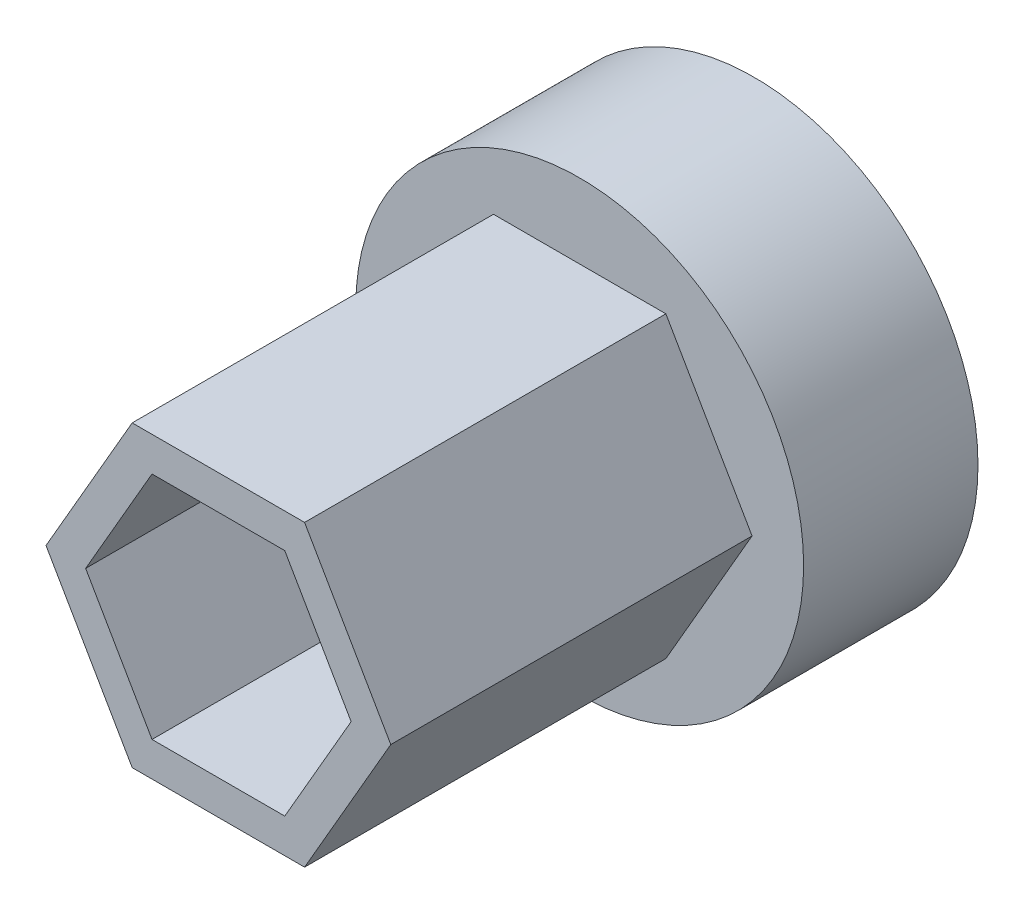
ISO-10303-21;
HEADER;
FILE_DESCRIPTION(('STEP AP214'),'2;1');
FILE_NAME('part.step','',(''),(''),'','','');
FILE_SCHEMA(('AUTOMOTIVE_DESIGN { 1 0 10303 214 1 1 1 1 }'));
ENDSEC;
DATA;
#1=APPLICATION_CONTEXT('core data for automotive mechanical design processes');
#2=APPLICATION_PROTOCOL_DEFINITION('international standard','automotive_design',2000,#1);
#3=PRODUCT_CONTEXT('',#1,'mechanical');
#4=PRODUCT('Part','Part','',(#3));
#5=PRODUCT_RELATED_PRODUCT_CATEGORY('part','',(#4));
#6=PRODUCT_DEFINITION_FORMATION('','',#4);
#7=PRODUCT_DEFINITION_CONTEXT('part definition',#1,'design');
#8=PRODUCT_DEFINITION('design','',#6,#7);
#9=PRODUCT_DEFINITION_SHAPE('','',#8);
#10=(LENGTH_UNIT() NAMED_UNIT(*) SI_UNIT(.MILLI.,.METRE.));
#11=(NAMED_UNIT(*) PLANE_ANGLE_UNIT() SI_UNIT($,.RADIAN.));
#12=(NAMED_UNIT(*) SI_UNIT($,.STERADIAN.) SOLID_ANGLE_UNIT());
#13=UNCERTAINTY_MEASURE_WITH_UNIT(LENGTH_MEASURE(1.E-05),#10,'distance_accuracy_value','');
#14=(GEOMETRIC_REPRESENTATION_CONTEXT(3) GLOBAL_UNCERTAINTY_ASSIGNED_CONTEXT((#13)) GLOBAL_UNIT_ASSIGNED_CONTEXT((#10,
#11,#12)) REPRESENTATION_CONTEXT('',''));
#15=CARTESIAN_POINT('',(0.,0.,0.));
#16=DIRECTION('',(0.,0.,1.));
#17=DIRECTION('',(1.,0.,0.));
#18=AXIS2_PLACEMENT_3D('',#15,#16,#17);
#19=CARTESIAN_POINT('',(0.,0.,15.367));
#20=DIRECTION('',(0.,0.,1.));
#21=DIRECTION('',(1.,0.,0.));
#22=AXIS2_PLACEMENT_3D('',#19,#20,#21);
#23=PLANE('',#22);
#24=DIRECTION('',(0.5,0.866025403784439,0.));
#25=VECTOR('',#24,1.);
#26=CARTESIAN_POINT('',(3.66617420935412,-6.35,15.367));
#27=LINE('',#26,#25);
#28=CARTESIAN_POINT('',(3.66617420935412,-6.35,15.367));
#29=VERTEX_POINT('',#28);
#30=CARTESIAN_POINT('',(7.33234841870825,0.,15.367));
#31=VERTEX_POINT('',#30);
#32=EDGE_CURVE('E158',#29,#31,#27,.T.);
#33=ORIENTED_EDGE('',*,*,#32,.T.);
#34=DIRECTION('',(-0.5,0.866025403784439,0.));
#35=VECTOR('',#34,1.);
#36=CARTESIAN_POINT('',(7.33234841870825,0.,15.367));
#37=LINE('',#36,#35);
#38=CARTESIAN_POINT('',(3.66617420935412,6.35,15.367));
#39=VERTEX_POINT('',#38);
#40=EDGE_CURVE('E173',#31,#39,#37,.T.);
#41=ORIENTED_EDGE('',*,*,#40,.T.);
#42=DIRECTION('',(-1.,0.,0.));
#43=VECTOR('',#42,1.);
#44=CARTESIAN_POINT('',(3.66617420935412,6.35,15.367));
#45=LINE('',#44,#43);
#46=CARTESIAN_POINT('',(-3.66617420935413,6.35,15.367));
#47=VERTEX_POINT('',#46);
#48=EDGE_CURVE('E112',#39,#47,#45,.T.);
#49=ORIENTED_EDGE('',*,*,#48,.T.);
#50=DIRECTION('',(-0.5,-0.866025403784439,0.));
#51=VECTOR('',#50,1.);
#52=CARTESIAN_POINT('',(-3.66617420935413,6.35,15.367));
#53=LINE('',#52,#51);
#54=CARTESIAN_POINT('',(-7.33234841870825,0.,15.367));
#55=VERTEX_POINT('',#54);
#56=EDGE_CURVE('E105',#47,#55,#53,.T.);
#57=ORIENTED_EDGE('',*,*,#56,.T.);
#58=DIRECTION('',(0.5,-0.866025403784439,0.));
#59=VECTOR('',#58,1.);
#60=CARTESIAN_POINT('',(-7.33234841870825,0.,15.367));
#61=LINE('',#60,#59);
#62=CARTESIAN_POINT('',(-3.66617420935413,-6.35,15.367));
#63=VERTEX_POINT('',#62);
#64=EDGE_CURVE('E109',#55,#63,#61,.T.);
#65=ORIENTED_EDGE('',*,*,#64,.T.);
#66=DIRECTION('',(1.,0.,0.));
#67=VECTOR('',#66,1.);
#68=CARTESIAN_POINT('',(-3.66617420935413,-6.35,15.367));
#69=LINE('',#68,#67);
#70=EDGE_CURVE('E70',#63,#29,#69,.T.);
#71=ORIENTED_EDGE('',*,*,#70,.T.);
#72=EDGE_LOOP('',(#33,#41,#49,#57,#65,#71));
#73=FACE_BOUND('',#72,.T.);
#74=DIRECTION('',(-0.500000000000001,0.866025403784438,0.));
#75=VECTOR('',#74,1.);
#76=CARTESIAN_POINT('',(5.64590828240532,0.,15.367));
#77=LINE('',#76,#75);
#78=CARTESIAN_POINT('',(5.64590828240532,0.,15.367));
#79=VERTEX_POINT('',#78);
#80=CARTESIAN_POINT('',(2.82295414120265,4.88949999999998,15.367));
#81=VERTEX_POINT('',#80);
#82=EDGE_CURVE('E216',#79,#81,#77,.T.);
#83=ORIENTED_EDGE('',*,*,#82,.F.);
#84=DIRECTION('',(0.499999999999995,0.866025403784442,0.));
#85=VECTOR('',#84,1.);
#86=CARTESIAN_POINT('',(2.82295414120272,-4.88949999999994,15.367));
#87=LINE('',#86,#85);
#88=CARTESIAN_POINT('',(2.82295414120272,-4.88949999999994,15.367));
#89=VERTEX_POINT('',#88);
#90=EDGE_CURVE('E333',#89,#79,#87,.T.);
#91=ORIENTED_EDGE('',*,*,#90,.F.);
#92=DIRECTION('',(1.,0.,0.));
#93=VECTOR('',#92,1.);
#94=CARTESIAN_POINT('',(-2.82295414120262,-4.8895,15.367));
#95=LINE('',#94,#93);
#96=CARTESIAN_POINT('',(-2.82295414120262,-4.8895,15.367));
#97=VERTEX_POINT('',#96);
#98=EDGE_CURVE('E92',#97,#89,#95,.T.);
#99=ORIENTED_EDGE('',*,*,#98,.F.);
#100=DIRECTION('',(0.500000000000007,-0.866025403784435,0.));
#101=VECTOR('',#100,1.);
#102=CARTESIAN_POINT('',(-5.64590828240532,0.,15.367));
#103=LINE('',#102,#101);
#104=CARTESIAN_POINT('',(-5.64590828240532,0.,15.367));
#105=VERTEX_POINT('',#104);
#106=EDGE_CURVE('E229',#105,#97,#103,.T.);
#107=ORIENTED_EDGE('',*,*,#106,.F.);
#108=DIRECTION('',(-0.499999999999995,-0.866025403784442,0.));
#109=VECTOR('',#108,1.);
#110=CARTESIAN_POINT('',(-2.82295414120268,4.88949999999996,15.367));
#111=LINE('',#110,#109);
#112=CARTESIAN_POINT('',(-2.82295414120268,4.88949999999996,15.367));
#113=VERTEX_POINT('',#112);
#114=EDGE_CURVE('E215',#113,#105,#111,.T.);
#115=ORIENTED_EDGE('',*,*,#114,.F.);
#116=DIRECTION('',(-1.,0.,0.));
#117=VECTOR('',#116,1.);
#118=CARTESIAN_POINT('',(2.82295414120265,4.88949999999998,15.367));
#119=LINE('',#118,#117);
#120=EDGE_CURVE('E203',#81,#113,#119,.T.);
#121=ORIENTED_EDGE('',*,*,#120,.F.);
#122=EDGE_LOOP('',(#83,#91,#99,#107,#115,#121));
#123=FACE_BOUND('',#122,.T.);
#124=ADVANCED_FACE('F45',(#73,#123),#23,.T.);
#125=CARTESIAN_POINT('',(3.66617420935412,-6.35,15.367));
#126=DIRECTION('',(-0.866025403784439,0.5,0.));
#127=DIRECTION('',(-0.5,-0.866025403784439,0.));
#128=AXIS2_PLACEMENT_3D('',#125,#126,#127);
#129=PLANE('',#128);
#130=DIRECTION('',(0.5,0.866025403784439,0.));
#131=VECTOR('',#130,1.);
#132=CARTESIAN_POINT('',(3.66617420935412,-6.35,0.));
#133=LINE('',#132,#131);
#134=CARTESIAN_POINT('',(3.66617420935412,-6.35,0.));
#135=VERTEX_POINT('',#134);
#136=CARTESIAN_POINT('',(7.33234841870825,0.,0.));
#137=VERTEX_POINT('',#136);
#138=EDGE_CURVE('E139',#135,#137,#133,.T.);
#139=ORIENTED_EDGE('',*,*,#138,.T.);
#140=DIRECTION('',(0.,0.,-1.));
#141=VECTOR('',#140,1.);
#142=CARTESIAN_POINT('',(7.33234841870825,0.,15.367));
#143=LINE('',#142,#141);
#144=EDGE_CURVE('E11',#31,#137,#143,.T.);
#145=ORIENTED_EDGE('',*,*,#144,.F.);
#146=ORIENTED_EDGE('',*,*,#32,.F.);
#147=DIRECTION('',(0.,0.,-1.));
#148=VECTOR('',#147,1.);
#149=CARTESIAN_POINT('',(3.66617420935412,-6.35,15.367));
#150=LINE('',#149,#148);
#151=EDGE_CURVE('E135',#29,#135,#150,.T.);
#152=ORIENTED_EDGE('',*,*,#151,.T.);
#153=EDGE_LOOP('',(#139,#145,#146,#152));
#154=FACE_BOUND('',#153,.T.);
#155=ADVANCED_FACE('F47',(#154),#129,.F.);
#156=CARTESIAN_POINT('',(7.33234841870825,0.,15.367));
#157=DIRECTION('',(-0.866025403784439,-0.5,0.));
#158=DIRECTION('',(0.5,-0.866025403784439,0.));
#159=AXIS2_PLACEMENT_3D('',#156,#157,#158);
#160=PLANE('',#159);
#161=DIRECTION('',(-0.5,0.866025403784439,0.));
#162=VECTOR('',#161,1.);
#163=CARTESIAN_POINT('',(7.33234841870825,0.,0.));
#164=LINE('',#163,#162);
#165=CARTESIAN_POINT('',(3.66617420935412,6.35,0.));
#166=VERTEX_POINT('',#165);
#167=EDGE_CURVE('E143',#137,#166,#164,.T.);
#168=ORIENTED_EDGE('',*,*,#167,.T.);
#169=DIRECTION('',(0.,0.,-1.));
#170=VECTOR('',#169,1.);
#171=CARTESIAN_POINT('',(3.66617420935412,6.35,15.367));
#172=LINE('',#171,#170);
#173=EDGE_CURVE('E54',#39,#166,#172,.T.);
#174=ORIENTED_EDGE('',*,*,#173,.F.);
#175=ORIENTED_EDGE('',*,*,#40,.F.);
#176=ORIENTED_EDGE('',*,*,#144,.T.);
#177=EDGE_LOOP('',(#168,#174,#175,#176));
#178=FACE_BOUND('',#177,.T.);
#179=ADVANCED_FACE('F172',(#178),#160,.F.);
#180=CARTESIAN_POINT('',(3.66617420935412,6.35,15.367));
#181=DIRECTION('',(0.,-1.,0.));
#182=DIRECTION('',(1.,0.,0.));
#183=AXIS2_PLACEMENT_3D('',#180,#181,#182);
#184=PLANE('',#183);
#185=DIRECTION('',(-1.,0.,0.));
#186=VECTOR('',#185,1.);
#187=CARTESIAN_POINT('',(3.66617420935412,6.35,0.));
#188=LINE('',#187,#186);
#189=CARTESIAN_POINT('',(-3.66617420935413,6.35,0.));
#190=VERTEX_POINT('',#189);
#191=EDGE_CURVE('E83',#166,#190,#188,.T.);
#192=ORIENTED_EDGE('',*,*,#191,.T.);
#193=DIRECTION('',(0.,0.,-1.));
#194=VECTOR('',#193,1.);
#195=CARTESIAN_POINT('',(-3.66617420935413,6.35,15.367));
#196=LINE('',#195,#194);
#197=EDGE_CURVE('E127',#47,#190,#196,.T.);
#198=ORIENTED_EDGE('',*,*,#197,.F.);
#199=ORIENTED_EDGE('',*,*,#48,.F.);
#200=ORIENTED_EDGE('',*,*,#173,.T.);
#201=EDGE_LOOP('',(#192,#198,#199,#200));
#202=FACE_BOUND('',#201,.T.);
#203=ADVANCED_FACE('F169',(#202),#184,.F.);
#204=CARTESIAN_POINT('',(-3.66617420935413,6.35,15.367));
#205=DIRECTION('',(0.866025403784439,-0.5,0.));
#206=DIRECTION('',(0.5,0.866025403784439,0.));
#207=AXIS2_PLACEMENT_3D('',#204,#205,#206);
#208=PLANE('',#207);
#209=DIRECTION('',(-0.5,-0.866025403784439,0.));
#210=VECTOR('',#209,1.);
#211=CARTESIAN_POINT('',(-3.66617420935413,6.35,0.));
#212=LINE('',#211,#210);
#213=CARTESIAN_POINT('',(-7.33234841870825,0.,0.));
#214=VERTEX_POINT('',#213);
#215=EDGE_CURVE('E123',#190,#214,#212,.T.);
#216=ORIENTED_EDGE('',*,*,#215,.T.);
#217=DIRECTION('',(0.,0.,-1.));
#218=VECTOR('',#217,1.);
#219=CARTESIAN_POINT('',(-7.33234841870825,0.,15.367));
#220=LINE('',#219,#218);
#221=EDGE_CURVE('E120',#55,#214,#220,.T.);
#222=ORIENTED_EDGE('',*,*,#221,.F.);
#223=ORIENTED_EDGE('',*,*,#56,.F.);
#224=ORIENTED_EDGE('',*,*,#197,.T.);
#225=EDGE_LOOP('',(#216,#222,#223,#224));
#226=FACE_BOUND('',#225,.T.);
#227=ADVANCED_FACE('F121',(#226),#208,.F.);
#228=CARTESIAN_POINT('',(-7.33234841870825,0.,15.367));
#229=DIRECTION('',(0.866025403784438,0.5,0.));
#230=DIRECTION('',(-0.5,0.866025403784439,0.));
#231=AXIS2_PLACEMENT_3D('',#228,#229,#230);
#232=PLANE('',#231);
#233=DIRECTION('',(0.5,-0.866025403784439,0.));
#234=VECTOR('',#233,1.);
#235=CARTESIAN_POINT('',(-7.33234841870825,0.,0.));
#236=LINE('',#235,#234);
#237=CARTESIAN_POINT('',(-3.66617420935413,-6.35,0.));
#238=VERTEX_POINT('',#237);
#239=EDGE_CURVE('E151',#214,#238,#236,.T.);
#240=ORIENTED_EDGE('',*,*,#239,.T.);
#241=DIRECTION('',(0.,0.,-1.));
#242=VECTOR('',#241,1.);
#243=CARTESIAN_POINT('',(-3.66617420935413,-6.35,15.367));
#244=LINE('',#243,#242);
#245=EDGE_CURVE('E128',#63,#238,#244,.T.);
#246=ORIENTED_EDGE('',*,*,#245,.F.);
#247=ORIENTED_EDGE('',*,*,#64,.F.);
#248=ORIENTED_EDGE('',*,*,#221,.T.);
#249=EDGE_LOOP('',(#240,#246,#247,#248));
#250=FACE_BOUND('',#249,.T.);
#251=ADVANCED_FACE('F130',(#250),#232,.F.);
#252=CARTESIAN_POINT('',(-3.66617420935413,-6.35,15.367));
#253=DIRECTION('',(0.,1.,0.));
#254=DIRECTION('',(-1.,0.,0.));
#255=AXIS2_PLACEMENT_3D('',#252,#253,#254);
#256=PLANE('',#255);
#257=DIRECTION('',(1.,0.,0.));
#258=VECTOR('',#257,1.);
#259=CARTESIAN_POINT('',(-3.66617420935413,-6.35,0.));
#260=LINE('',#259,#258);
#261=EDGE_CURVE('E154',#238,#135,#260,.T.);
#262=ORIENTED_EDGE('',*,*,#261,.T.);
#263=ORIENTED_EDGE('',*,*,#151,.F.);
#264=ORIENTED_EDGE('',*,*,#70,.F.);
#265=ORIENTED_EDGE('',*,*,#245,.T.);
#266=EDGE_LOOP('',(#262,#263,#264,#265));
#267=FACE_BOUND('',#266,.T.);
#268=ADVANCED_FACE('F257',(#267),#256,.F.);
#269=CARTESIAN_POINT('',(2.82295414120272,-4.88949999999994,15.367));
#270=DIRECTION('',(-0.866025403784441,0.499999999999995,0.));
#271=DIRECTION('',(-0.499999999999995,-0.866025403784442,0.));
#272=AXIS2_PLACEMENT_3D('',#269,#270,#271);
#273=PLANE('',#272);
#274=DIRECTION('',(0.,0.,-1.));
#275=VECTOR('',#274,1.);
#276=CARTESIAN_POINT('',(5.64590828240532,0.,15.367));
#277=LINE('',#276,#275);
#278=CARTESIAN_POINT('',(5.64590828240532,0.,-7.4168));
#279=VERTEX_POINT('',#278);
#280=EDGE_CURVE('E144',#79,#279,#277,.T.);
#281=ORIENTED_EDGE('',*,*,#280,.T.);
#282=DIRECTION('',(-0.499999999999994,-0.866025403784442,0.));
#283=VECTOR('',#282,1.);
#284=CARTESIAN_POINT('',(5.64590828240532,0.,-7.4168));
#285=LINE('',#284,#283);
#286=CARTESIAN_POINT('',(2.8229541412027,-4.88949999999996,-7.4168));
#287=VERTEX_POINT('',#286);
#288=EDGE_CURVE('E323',#279,#287,#285,.T.);
#289=ORIENTED_EDGE('',*,*,#288,.T.);
#290=DIRECTION('',(0.,0.,-1.));
#291=VECTOR('',#290,1.);
#292=CARTESIAN_POINT('',(2.82295414120272,-4.88949999999994,15.367));
#293=LINE('',#292,#291);
#294=EDGE_CURVE('E238',#89,#287,#293,.T.);
#295=ORIENTED_EDGE('',*,*,#294,.F.);
#296=ORIENTED_EDGE('',*,*,#90,.T.);
#297=EDGE_LOOP('',(#281,#289,#295,#296));
#298=FACE_BOUND('',#297,.T.);
#299=ADVANCED_FACE('F259',(#298),#273,.T.);
#300=CARTESIAN_POINT('',(5.64590828240532,0.,15.367));
#301=DIRECTION('',(-0.866025403784438,-0.500000000000001,0.));
#302=DIRECTION('',(0.500000000000001,-0.866025403784438,0.));
#303=AXIS2_PLACEMENT_3D('',#300,#301,#302);
#304=PLANE('',#303);
#305=DIRECTION('',(0.,0.,-1.));
#306=VECTOR('',#305,1.);
#307=CARTESIAN_POINT('',(2.82295414120265,4.88949999999998,15.367));
#308=LINE('',#307,#306);
#309=CARTESIAN_POINT('',(2.82295414120263,4.8895,-7.4168));
#310=VERTEX_POINT('',#309);
#311=EDGE_CURVE('E211',#81,#310,#308,.T.);
#312=ORIENTED_EDGE('',*,*,#311,.T.);
#313=DIRECTION('',(0.500000000000006,-0.866025403784435,0.));
#314=VECTOR('',#313,1.);
#315=CARTESIAN_POINT('',(2.82295414120263,4.8895,-7.4168));
#316=LINE('',#315,#314);
#317=EDGE_CURVE('E316',#310,#279,#316,.T.);
#318=ORIENTED_EDGE('',*,*,#317,.T.);
#319=ORIENTED_EDGE('',*,*,#280,.F.);
#320=ORIENTED_EDGE('',*,*,#82,.T.);
#321=EDGE_LOOP('',(#312,#318,#319,#320));
#322=FACE_BOUND('',#321,.T.);
#323=ADVANCED_FACE('F265',(#322),#304,.T.);
#324=CARTESIAN_POINT('',(2.82295414120265,4.88949999999998,15.367));
#325=DIRECTION('',(0.,-1.,0.));
#326=DIRECTION('',(1.,0.,0.));
#327=AXIS2_PLACEMENT_3D('',#324,#325,#326);
#328=PLANE('',#327);
#329=DIRECTION('',(0.,0.,-1.));
#330=VECTOR('',#329,1.);
#331=CARTESIAN_POINT('',(-2.82295414120268,4.88949999999996,15.367));
#332=LINE('',#331,#330);
#333=CARTESIAN_POINT('',(-2.8229541412027,4.88949999999996,-7.4168));
#334=VERTEX_POINT('',#333);
#335=EDGE_CURVE('E208',#113,#334,#332,.T.);
#336=ORIENTED_EDGE('',*,*,#335,.T.);
#337=DIRECTION('',(1.,0.,0.));
#338=VECTOR('',#337,1.);
#339=CARTESIAN_POINT('',(-2.8229541412027,4.88949999999996,-7.4168));
#340=LINE('',#339,#338);
#341=EDGE_CURVE('E310',#334,#310,#340,.T.);
#342=ORIENTED_EDGE('',*,*,#341,.T.);
#343=ORIENTED_EDGE('',*,*,#311,.F.);
#344=ORIENTED_EDGE('',*,*,#120,.T.);
#345=EDGE_LOOP('',(#336,#342,#343,#344));
#346=FACE_BOUND('',#345,.T.);
#347=ADVANCED_FACE('F205',(#346),#328,.T.);
#348=CARTESIAN_POINT('',(-2.82295414120268,4.88949999999996,15.367));
#349=DIRECTION('',(0.866025403784441,-0.499999999999995,0.));
#350=DIRECTION('',(0.499999999999995,0.866025403784442,0.));
#351=AXIS2_PLACEMENT_3D('',#348,#349,#350);
#352=PLANE('',#351);
#353=DIRECTION('',(0.,0.,-1.));
#354=VECTOR('',#353,1.);
#355=CARTESIAN_POINT('',(-5.64590828240532,0.,15.367));
#356=LINE('',#355,#354);
#357=CARTESIAN_POINT('',(-5.64590828240532,0.,-7.4168));
#358=VERTEX_POINT('',#357);
#359=EDGE_CURVE('E226',#105,#358,#356,.T.);
#360=ORIENTED_EDGE('',*,*,#359,.T.);
#361=DIRECTION('',(0.499999999999994,0.866025403784442,0.));
#362=VECTOR('',#361,1.);
#363=CARTESIAN_POINT('',(-5.64590828240532,0.,-7.4168));
#364=LINE('',#363,#362);
#365=EDGE_CURVE('E223',#358,#334,#364,.T.);
#366=ORIENTED_EDGE('',*,*,#365,.T.);
#367=ORIENTED_EDGE('',*,*,#335,.F.);
#368=ORIENTED_EDGE('',*,*,#114,.T.);
#369=EDGE_LOOP('',(#360,#366,#367,#368));
#370=FACE_BOUND('',#369,.T.);
#371=ADVANCED_FACE('F220',(#370),#352,.T.);
#372=CARTESIAN_POINT('',(-5.64590828240532,0.,15.367));
#373=DIRECTION('',(0.866025403784435,0.500000000000007,0.));
#374=DIRECTION('',(-0.500000000000007,0.866025403784435,0.));
#375=AXIS2_PLACEMENT_3D('',#372,#373,#374);
#376=PLANE('',#375);
#377=DIRECTION('',(0.,0.,-1.));
#378=VECTOR('',#377,1.);
#379=CARTESIAN_POINT('',(-2.82295414120262,-4.8895,15.367));
#380=LINE('',#379,#378);
#381=CARTESIAN_POINT('',(-2.82295414120262,-4.8895,-7.4168));
#382=VERTEX_POINT('',#381);
#383=EDGE_CURVE('E61',#97,#382,#380,.T.);
#384=ORIENTED_EDGE('',*,*,#383,.T.);
#385=DIRECTION('',(-0.500000000000006,0.866025403784435,0.));
#386=VECTOR('',#385,1.);
#387=CARTESIAN_POINT('',(-2.82295414120262,-4.8895,-7.4168));
#388=LINE('',#387,#386);
#389=EDGE_CURVE('E308',#382,#358,#388,.T.);
#390=ORIENTED_EDGE('',*,*,#389,.T.);
#391=ORIENTED_EDGE('',*,*,#359,.F.);
#392=ORIENTED_EDGE('',*,*,#106,.T.);
#393=EDGE_LOOP('',(#384,#390,#391,#392));
#394=FACE_BOUND('',#393,.T.);
#395=ADVANCED_FACE('F282',(#394),#376,.T.);
#396=CARTESIAN_POINT('',(-2.82295414120262,-4.8895,15.367));
#397=DIRECTION('',(0.,1.,0.));
#398=DIRECTION('',(-1.,0.,0.));
#399=AXIS2_PLACEMENT_3D('',#396,#397,#398);
#400=PLANE('',#399);
#401=ORIENTED_EDGE('',*,*,#294,.T.);
#402=DIRECTION('',(-1.,0.,0.));
#403=VECTOR('',#402,1.);
#404=CARTESIAN_POINT('',(2.8229541412027,-4.88949999999996,-7.4168));
#405=LINE('',#404,#403);
#406=EDGE_CURVE('E327',#287,#382,#405,.T.);
#407=ORIENTED_EDGE('',*,*,#406,.T.);
#408=ORIENTED_EDGE('',*,*,#383,.F.);
#409=ORIENTED_EDGE('',*,*,#98,.T.);
#410=EDGE_LOOP('',(#401,#407,#408,#409));
#411=FACE_BOUND('',#410,.T.);
#412=ADVANCED_FACE('F285',(#411),#400,.T.);
#413=CARTESIAN_POINT('',(0.,0.,-7.4168));
#414=DIRECTION('',(0.,0.,-1.));
#415=DIRECTION('',(-1.,0.,0.));
#416=AXIS2_PLACEMENT_3D('',#413,#414,#415);
#417=PLANE('',#416);
#418=CARTESIAN_POINT('',(0.,0.,-7.4168));
#419=DIRECTION('',(0.,0.,-1.));
#420=DIRECTION('',(-1.,0.,0.));
#421=AXIS2_PLACEMENT_3D('',#418,#419,#420);
#422=CIRCLE('',#421,9.525);
#423=CARTESIAN_POINT('',(-9.525,0.,-7.4168));
#424=VERTEX_POINT('',#423);
#425=EDGE_CURVE('E303',#424,#424,#422,.T.);
#426=ORIENTED_EDGE('',*,*,#425,.T.);
#427=EDGE_LOOP('',(#426));
#428=FACE_BOUND('',#427,.T.);
#429=ORIENTED_EDGE('',*,*,#365,.F.);
#430=ORIENTED_EDGE('',*,*,#389,.F.);
#431=ORIENTED_EDGE('',*,*,#406,.F.);
#432=ORIENTED_EDGE('',*,*,#288,.F.);
#433=ORIENTED_EDGE('',*,*,#317,.F.);
#434=ORIENTED_EDGE('',*,*,#341,.F.);
#435=EDGE_LOOP('',(#429,#430,#431,#432,#433,#434));
#436=FACE_BOUND('',#435,.T.);
#437=ADVANCED_FACE('F289',(#428,#436),#417,.T.);
#438=CARTESIAN_POINT('',(0.,0.,0.));
#439=DIRECTION('',(0.,0.,-1.));
#440=DIRECTION('',(-1.,0.,0.));
#441=AXIS2_PLACEMENT_3D('',#438,#439,#440);
#442=PLANE('',#441);
#443=ORIENTED_EDGE('',*,*,#138,.F.);
#444=ORIENTED_EDGE('',*,*,#261,.F.);
#445=ORIENTED_EDGE('',*,*,#239,.F.);
#446=ORIENTED_EDGE('',*,*,#215,.F.);
#447=ORIENTED_EDGE('',*,*,#191,.F.);
#448=ORIENTED_EDGE('',*,*,#167,.F.);
#449=EDGE_LOOP('',(#443,#444,#445,#446,#447,#448));
#450=FACE_BOUND('',#449,.T.);
#451=CARTESIAN_POINT('',(0.,0.,0.));
#452=DIRECTION('',(0.,0.,-1.));
#453=DIRECTION('',(-1.,0.,0.));
#454=AXIS2_PLACEMENT_3D('',#451,#452,#453);
#455=CIRCLE('',#454,9.525);
#456=CARTESIAN_POINT('',(-9.525,0.,0.));
#457=VERTEX_POINT('',#456);
#458=EDGE_CURVE('E330',#457,#457,#455,.T.);
#459=ORIENTED_EDGE('',*,*,#458,.F.);
#460=EDGE_LOOP('',(#459));
#461=FACE_BOUND('',#460,.T.);
#462=ADVANCED_FACE('F177',(#450,#461),#442,.F.);
#463=CARTESIAN_POINT('',(0.,0.,-7.4168));
#464=DIRECTION('',(0.,0.,1.));
#465=DIRECTION('',(1.,0.,0.));
#466=AXIS2_PLACEMENT_3D('',#463,#464,#465);
#467=CYLINDRICAL_SURFACE('',#466,9.525);
#468=ORIENTED_EDGE('',*,*,#425,.F.);
#469=EDGE_LOOP('',(#468));
#470=FACE_BOUND('',#469,.T.);
#471=ORIENTED_EDGE('',*,*,#458,.T.);
#472=EDGE_LOOP('',(#471));
#473=FACE_BOUND('',#472,.T.);
#474=ADVANCED_FACE('F290',(#470,#473),#467,.T.);
#475=CLOSED_SHELL('',(#124,#155,#179,#203,#227,#251,#268,#299,#323,#347,#371,#395,#412,#437,
#462,#474));
#476=MANIFOLD_SOLID_BREP('B2',#475);
#477=ADVANCED_BREP_SHAPE_REPRESENTATION('',(#18,#476),#14);
#478=SHAPE_DEFINITION_REPRESENTATION(#9,#477);
ENDSEC;
END-ISO-10303-21;
